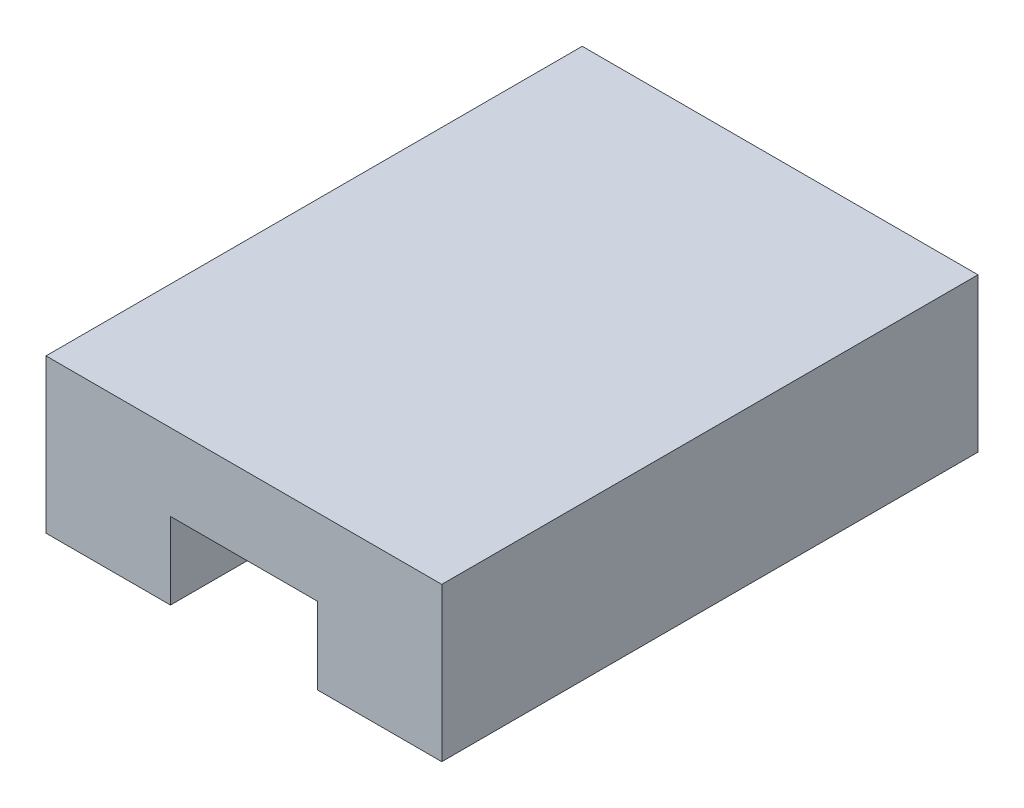
ISO-10303-21;
HEADER;
FILE_DESCRIPTION(('STEP AP214'),'2;1');
FILE_NAME('part.step','',(''),(''),'','','');
FILE_SCHEMA(('AUTOMOTIVE_DESIGN { 1 0 10303 214 1 1 1 1 }'));
ENDSEC;
DATA;
#1=APPLICATION_CONTEXT('core data for automotive mechanical design processes');
#2=APPLICATION_PROTOCOL_DEFINITION('international standard','automotive_design',2000,#1);
#3=PRODUCT_CONTEXT('',#1,'mechanical');
#4=PRODUCT('Part','Part','',(#3));
#5=PRODUCT_RELATED_PRODUCT_CATEGORY('part','',(#4));
#6=PRODUCT_DEFINITION_FORMATION('','',#4);
#7=PRODUCT_DEFINITION_CONTEXT('part definition',#1,'design');
#8=PRODUCT_DEFINITION('design','',#6,#7);
#9=PRODUCT_DEFINITION_SHAPE('','',#8);
#10=(LENGTH_UNIT() NAMED_UNIT(*) SI_UNIT(.MILLI.,.METRE.));
#11=(NAMED_UNIT(*) PLANE_ANGLE_UNIT() SI_UNIT($,.RADIAN.));
#12=(NAMED_UNIT(*) SI_UNIT($,.STERADIAN.) SOLID_ANGLE_UNIT());
#13=UNCERTAINTY_MEASURE_WITH_UNIT(LENGTH_MEASURE(1.E-05),#10,'distance_accuracy_value','');
#14=(GEOMETRIC_REPRESENTATION_CONTEXT(3) GLOBAL_UNCERTAINTY_ASSIGNED_CONTEXT((#13)) GLOBAL_UNIT_ASSIGNED_CONTEXT((#10,
#11,#12)) REPRESENTATION_CONTEXT('',''));
#15=CARTESIAN_POINT('',(0.,0.,0.));
#16=DIRECTION('',(0.,0.,1.));
#17=DIRECTION('',(1.,0.,0.));
#18=AXIS2_PLACEMENT_3D('',#15,#16,#17);
#19=CARTESIAN_POINT('',(-6.0732394366197,-7.08809859154929,84.));
#20=DIRECTION('',(0.,1.,0.));
#21=DIRECTION('',(-1.,0.,0.));
#22=AXIS2_PLACEMENT_3D('',#19,#20,#21);
#23=PLANE('',#22);
#24=DIRECTION('',(1.,0.,0.));
#25=VECTOR('',#24,1.);
#26=CARTESIAN_POINT('',(-6.0732394366197,-7.08809859154929,0.));
#27=LINE('',#26,#25);
#28=CARTESIAN_POINT('',(-25.5732394366197,-7.08809859154929,0.));
#29=VERTEX_POINT('',#28);
#30=CARTESIAN_POINT('',(-6.0732394366197,-7.08809859154929,0.));
#31=VERTEX_POINT('',#30);
#32=EDGE_CURVE('E144',#29,#31,#27,.T.);
#33=ORIENTED_EDGE('',*,*,#32,.T.);
#34=DIRECTION('',(0.,0.,-1.));
#35=VECTOR('',#34,1.);
#36=CARTESIAN_POINT('',(-6.0732394366197,-7.08809859154929,84.));
#37=LINE('',#36,#35);
#38=CARTESIAN_POINT('',(-6.0732394366197,-7.08809859154929,84.));
#39=VERTEX_POINT('',#38);
#40=EDGE_CURVE('E11',#39,#31,#37,.T.);
#41=ORIENTED_EDGE('',*,*,#40,.F.);
#42=DIRECTION('',(1.,0.,0.));
#43=VECTOR('',#42,1.);
#44=CARTESIAN_POINT('',(-6.0732394366197,-7.08809859154929,84.));
#45=LINE('',#44,#43);
#46=CARTESIAN_POINT('',(-25.5732394366197,-7.08809859154929,84.));
#47=VERTEX_POINT('',#46);
#48=EDGE_CURVE('E166',#47,#39,#45,.T.);
#49=ORIENTED_EDGE('',*,*,#48,.F.);
#50=DIRECTION('',(0.,0.,-1.));
#51=VECTOR('',#50,1.);
#52=CARTESIAN_POINT('',(-25.5732394366197,-7.08809859154929,84.));
#53=LINE('',#52,#51);
#54=EDGE_CURVE('E140',#47,#29,#53,.T.);
#55=ORIENTED_EDGE('',*,*,#54,.T.);
#56=EDGE_LOOP('',(#33,#41,#49,#55));
#57=FACE_BOUND('',#56,.T.);
#58=ADVANCED_FACE('F43',(#57),#23,.F.);
#59=CARTESIAN_POINT('',(-6.07323943661971,4.94190140845071,84.));
#60=DIRECTION('',(-1.,0.,0.));
#61=DIRECTION('',(0.,-1.,0.));
#62=AXIS2_PLACEMENT_3D('',#59,#60,#61);
#63=PLANE('',#62);
#64=DIRECTION('',(0.,1.,0.));
#65=VECTOR('',#64,1.);
#66=CARTESIAN_POINT('',(-6.07323943661971,4.94190140845071,0.));
#67=LINE('',#66,#65);
#68=CARTESIAN_POINT('',(-6.07323943661971,4.94190140845071,0.));
#69=VERTEX_POINT('',#68);
#70=EDGE_CURVE('E148',#31,#69,#67,.T.);
#71=ORIENTED_EDGE('',*,*,#70,.T.);
#72=DIRECTION('',(0.,0.,-1.));
#73=VECTOR('',#72,1.);
#74=CARTESIAN_POINT('',(-6.07323943661971,4.94190140845071,84.));
#75=LINE('',#74,#73);
#76=CARTESIAN_POINT('',(-6.07323943661971,4.94190140845071,84.));
#77=VERTEX_POINT('',#76);
#78=EDGE_CURVE('E52',#77,#69,#75,.T.);
#79=ORIENTED_EDGE('',*,*,#78,.F.);
#80=DIRECTION('',(0.,1.,0.));
#81=VECTOR('',#80,1.);
#82=CARTESIAN_POINT('',(-6.07323943661971,4.94190140845071,84.));
#83=LINE('',#82,#81);
#84=EDGE_CURVE('E103',#39,#77,#83,.T.);
#85=ORIENTED_EDGE('',*,*,#84,.F.);
#86=ORIENTED_EDGE('',*,*,#40,.T.);
#87=EDGE_LOOP('',(#71,#79,#85,#86));
#88=FACE_BOUND('',#87,.T.);
#89=ADVANCED_FACE('F212',(#88),#63,.F.);
#90=CARTESIAN_POINT('',(16.9267605633803,4.94190140845071,84.));
#91=DIRECTION('',(0.,1.,0.));
#92=DIRECTION('',(-1.,0.,0.));
#93=AXIS2_PLACEMENT_3D('',#90,#91,#92);
#94=PLANE('',#93);
#95=DIRECTION('',(1.,0.,0.));
#96=VECTOR('',#95,1.);
#97=CARTESIAN_POINT('',(16.9267605633803,4.94190140845071,0.));
#98=LINE('',#97,#96);
#99=CARTESIAN_POINT('',(16.9267605633803,4.94190140845071,0.));
#100=VERTEX_POINT('',#99);
#101=EDGE_CURVE('E151',#69,#100,#98,.T.);
#102=ORIENTED_EDGE('',*,*,#101,.T.);
#103=DIRECTION('',(0.,0.,-1.));
#104=VECTOR('',#103,1.);
#105=CARTESIAN_POINT('',(16.9267605633803,4.94190140845071,84.));
#106=LINE('',#105,#104);
#107=CARTESIAN_POINT('',(16.9267605633803,4.94190140845071,84.));
#108=VERTEX_POINT('',#107);
#109=EDGE_CURVE('E177',#108,#100,#106,.T.);
#110=ORIENTED_EDGE('',*,*,#109,.F.);
#111=DIRECTION('',(1.,0.,0.));
#112=VECTOR('',#111,1.);
#113=CARTESIAN_POINT('',(16.9267605633803,4.94190140845071,84.));
#114=LINE('',#113,#112);
#115=EDGE_CURVE('E187',#77,#108,#114,.T.);
#116=ORIENTED_EDGE('',*,*,#115,.F.);
#117=ORIENTED_EDGE('',*,*,#78,.T.);
#118=EDGE_LOOP('',(#102,#110,#116,#117));
#119=FACE_BOUND('',#118,.T.);
#120=ADVANCED_FACE('F185',(#119),#94,.F.);
#121=CARTESIAN_POINT('',(16.9267605633803,-7.08809859154929,84.));
#122=DIRECTION('',(1.,0.,0.));
#123=DIRECTION('',(0.,0.,-1.));
#124=AXIS2_PLACEMENT_3D('',#121,#122,#123);
#125=PLANE('',#124);
#126=DIRECTION('',(0.,-1.,0.));
#127=VECTOR('',#126,1.);
#128=CARTESIAN_POINT('',(16.9267605633803,-7.08809859154929,0.));
#129=LINE('',#128,#127);
#130=CARTESIAN_POINT('',(16.9267605633803,-7.08809859154929,0.));
#131=VERTEX_POINT('',#130);
#132=EDGE_CURVE('E154',#100,#131,#129,.T.);
#133=ORIENTED_EDGE('',*,*,#132,.T.);
#134=DIRECTION('',(0.,0.,-1.));
#135=VECTOR('',#134,1.);
#136=CARTESIAN_POINT('',(16.9267605633803,-7.08809859154929,84.));
#137=LINE('',#136,#135);
#138=CARTESIAN_POINT('',(16.9267605633803,-7.08809859154929,84.));
#139=VERTEX_POINT('',#138);
#140=EDGE_CURVE('E173',#139,#131,#137,.T.);
#141=ORIENTED_EDGE('',*,*,#140,.F.);
#142=DIRECTION('',(0.,-1.,0.));
#143=VECTOR('',#142,1.);
#144=CARTESIAN_POINT('',(16.9267605633803,-7.08809859154929,84.));
#145=LINE('',#144,#143);
#146=EDGE_CURVE('E200',#108,#139,#145,.T.);
#147=ORIENTED_EDGE('',*,*,#146,.F.);
#148=ORIENTED_EDGE('',*,*,#109,.T.);
#149=EDGE_LOOP('',(#133,#141,#147,#148));
#150=FACE_BOUND('',#149,.T.);
#151=ADVANCED_FACE('F195',(#150),#125,.F.);
#152=CARTESIAN_POINT('',(36.4267605633803,-7.08809859154929,84.));
#153=DIRECTION('',(0.,1.,0.));
#154=DIRECTION('',(-1.,0.,0.));
#155=AXIS2_PLACEMENT_3D('',#152,#153,#154);
#156=PLANE('',#155);
#157=DIRECTION('',(1.,0.,0.));
#158=VECTOR('',#157,1.);
#159=CARTESIAN_POINT('',(36.4267605633803,-7.08809859154929,0.));
#160=LINE('',#159,#158);
#161=CARTESIAN_POINT('',(36.4267605633803,-7.08809859154929,0.));
#162=VERTEX_POINT('',#161);
#163=EDGE_CURVE('E157',#131,#162,#160,.T.);
#164=ORIENTED_EDGE('',*,*,#163,.T.);
#165=DIRECTION('',(0.,0.,-1.));
#166=VECTOR('',#165,1.);
#167=CARTESIAN_POINT('',(36.4267605633803,-7.08809859154929,84.));
#168=LINE('',#167,#166);
#169=CARTESIAN_POINT('',(36.4267605633803,-7.08809859154929,84.));
#170=VERTEX_POINT('',#169);
#171=EDGE_CURVE('E133',#170,#162,#168,.T.);
#172=ORIENTED_EDGE('',*,*,#171,.F.);
#173=DIRECTION('',(1.,0.,0.));
#174=VECTOR('',#173,1.);
#175=CARTESIAN_POINT('',(36.4267605633803,-7.08809859154929,84.));
#176=LINE('',#175,#174);
#177=EDGE_CURVE('E122',#139,#170,#176,.T.);
#178=ORIENTED_EDGE('',*,*,#177,.F.);
#179=ORIENTED_EDGE('',*,*,#140,.T.);
#180=EDGE_LOOP('',(#164,#172,#178,#179));
#181=FACE_BOUND('',#180,.T.);
#182=ADVANCED_FACE('F198',(#181),#156,.F.);
#183=CARTESIAN_POINT('',(36.4267605633803,16.9719014084507,84.));
#184=DIRECTION('',(-1.,0.,0.));
#185=DIRECTION('',(0.,0.,1.));
#186=AXIS2_PLACEMENT_3D('',#183,#184,#185);
#187=PLANE('',#186);
#188=DIRECTION('',(0.,1.,0.));
#189=VECTOR('',#188,1.);
#190=CARTESIAN_POINT('',(36.4267605633803,16.9719014084507,0.));
#191=LINE('',#190,#189);
#192=CARTESIAN_POINT('',(36.4267605633803,16.9719014084507,0.));
#193=VERTEX_POINT('',#192);
#194=EDGE_CURVE('E131',#162,#193,#191,.T.);
#195=ORIENTED_EDGE('',*,*,#194,.T.);
#196=DIRECTION('',(0.,0.,-1.));
#197=VECTOR('',#196,1.);
#198=CARTESIAN_POINT('',(36.4267605633803,16.9719014084507,84.));
#199=LINE('',#198,#197);
#200=CARTESIAN_POINT('',(36.4267605633803,16.9719014084507,84.));
#201=VERTEX_POINT('',#200);
#202=EDGE_CURVE('E128',#201,#193,#199,.T.);
#203=ORIENTED_EDGE('',*,*,#202,.F.);
#204=DIRECTION('',(0.,1.,0.));
#205=VECTOR('',#204,1.);
#206=CARTESIAN_POINT('',(36.4267605633803,16.9719014084507,84.));
#207=LINE('',#206,#205);
#208=EDGE_CURVE('E116',#170,#201,#207,.T.);
#209=ORIENTED_EDGE('',*,*,#208,.F.);
#210=ORIENTED_EDGE('',*,*,#171,.T.);
#211=EDGE_LOOP('',(#195,#203,#209,#210));
#212=FACE_BOUND('',#211,.T.);
#213=ADVANCED_FACE('F129',(#212),#187,.F.);
#214=CARTESIAN_POINT('',(-25.5732394366197,16.9719014084507,84.));
#215=DIRECTION('',(0.,-1.,0.));
#216=DIRECTION('',(1.,0.,0.));
#217=AXIS2_PLACEMENT_3D('',#214,#215,#216);
#218=PLANE('',#217);
#219=DIRECTION('',(-1.,0.,0.));
#220=VECTOR('',#219,1.);
#221=CARTESIAN_POINT('',(-25.5732394366197,16.9719014084507,0.));
#222=LINE('',#221,#220);
#223=CARTESIAN_POINT('',(-25.5732394366197,16.9719014084507,0.));
#224=VERTEX_POINT('',#223);
#225=EDGE_CURVE('E89',#193,#224,#222,.T.);
#226=ORIENTED_EDGE('',*,*,#225,.T.);
#227=DIRECTION('',(0.,0.,-1.));
#228=VECTOR('',#227,1.);
#229=CARTESIAN_POINT('',(-25.5732394366197,16.9719014084507,84.));
#230=LINE('',#229,#228);
#231=CARTESIAN_POINT('',(-25.5732394366197,16.9719014084507,84.));
#232=VERTEX_POINT('',#231);
#233=EDGE_CURVE('E134',#232,#224,#230,.T.);
#234=ORIENTED_EDGE('',*,*,#233,.F.);
#235=DIRECTION('',(-1.,0.,0.));
#236=VECTOR('',#235,1.);
#237=CARTESIAN_POINT('',(-25.5732394366197,16.9719014084507,84.));
#238=LINE('',#237,#236);
#239=EDGE_CURVE('E120',#201,#232,#238,.T.);
#240=ORIENTED_EDGE('',*,*,#239,.F.);
#241=ORIENTED_EDGE('',*,*,#202,.T.);
#242=EDGE_LOOP('',(#226,#234,#240,#241));
#243=FACE_BOUND('',#242,.T.);
#244=ADVANCED_FACE('F136',(#243),#218,.F.);
#245=CARTESIAN_POINT('',(-25.5732394366197,-7.08809859154929,84.));
#246=DIRECTION('',(1.,0.,0.));
#247=DIRECTION('',(0.,0.,-1.));
#248=AXIS2_PLACEMENT_3D('',#245,#246,#247);
#249=PLANE('',#248);
#250=DIRECTION('',(0.,-1.,0.));
#251=VECTOR('',#250,1.);
#252=CARTESIAN_POINT('',(-25.5732394366197,-7.08809859154929,0.));
#253=LINE('',#252,#251);
#254=EDGE_CURVE('E95',#224,#29,#253,.T.);
#255=ORIENTED_EDGE('',*,*,#254,.T.);
#256=ORIENTED_EDGE('',*,*,#54,.F.);
#257=DIRECTION('',(0.,-1.,0.));
#258=VECTOR('',#257,1.);
#259=CARTESIAN_POINT('',(-25.5732394366197,-7.08809859154929,84.));
#260=LINE('',#259,#258);
#261=EDGE_CURVE('E60',#232,#47,#260,.T.);
#262=ORIENTED_EDGE('',*,*,#261,.F.);
#263=ORIENTED_EDGE('',*,*,#233,.T.);
#264=EDGE_LOOP('',(#255,#256,#262,#263));
#265=FACE_BOUND('',#264,.T.);
#266=ADVANCED_FACE('F228',(#265),#249,.F.);
#267=CARTESIAN_POINT('',(0.,0.,84.));
#268=DIRECTION('',(0.,0.,-1.));
#269=DIRECTION('',(-1.,0.,0.));
#270=AXIS2_PLACEMENT_3D('',#267,#268,#269);
#271=PLANE('',#270);
#272=ORIENTED_EDGE('',*,*,#48,.T.);
#273=ORIENTED_EDGE('',*,*,#84,.T.);
#274=ORIENTED_EDGE('',*,*,#115,.T.);
#275=ORIENTED_EDGE('',*,*,#146,.T.);
#276=ORIENTED_EDGE('',*,*,#177,.T.);
#277=ORIENTED_EDGE('',*,*,#208,.T.);
#278=ORIENTED_EDGE('',*,*,#239,.T.);
#279=ORIENTED_EDGE('',*,*,#261,.T.);
#280=EDGE_LOOP('',(#272,#273,#274,#275,#276,#277,#278,#279));
#281=FACE_BOUND('',#280,.T.);
#282=ADVANCED_FACE('F118',(#281),#271,.F.);
#283=CARTESIAN_POINT('',(0.,0.,0.));
#284=DIRECTION('',(0.,0.,-1.));
#285=DIRECTION('',(-1.,0.,0.));
#286=AXIS2_PLACEMENT_3D('',#283,#284,#285);
#287=PLANE('',#286);
#288=ORIENTED_EDGE('',*,*,#32,.F.);
#289=ORIENTED_EDGE('',*,*,#254,.F.);
#290=ORIENTED_EDGE('',*,*,#225,.F.);
#291=ORIENTED_EDGE('',*,*,#194,.F.);
#292=ORIENTED_EDGE('',*,*,#163,.F.);
#293=ORIENTED_EDGE('',*,*,#132,.F.);
#294=ORIENTED_EDGE('',*,*,#101,.F.);
#295=ORIENTED_EDGE('',*,*,#70,.F.);
#296=EDGE_LOOP('',(#288,#289,#290,#291,#292,#293,#294,#295));
#297=FACE_BOUND('',#296,.T.);
#298=ADVANCED_FACE('F191',(#297),#287,.T.);
#299=CLOSED_SHELL('',(#58,#89,#120,#151,#182,#213,#244,#266,#282,#298));
#300=MANIFOLD_SOLID_BREP('B2',#299);
#301=ADVANCED_BREP_SHAPE_REPRESENTATION('',(#18,#300),#14);
#302=SHAPE_DEFINITION_REPRESENTATION(#9,#301);
ENDSEC;
END-ISO-10303-21;
